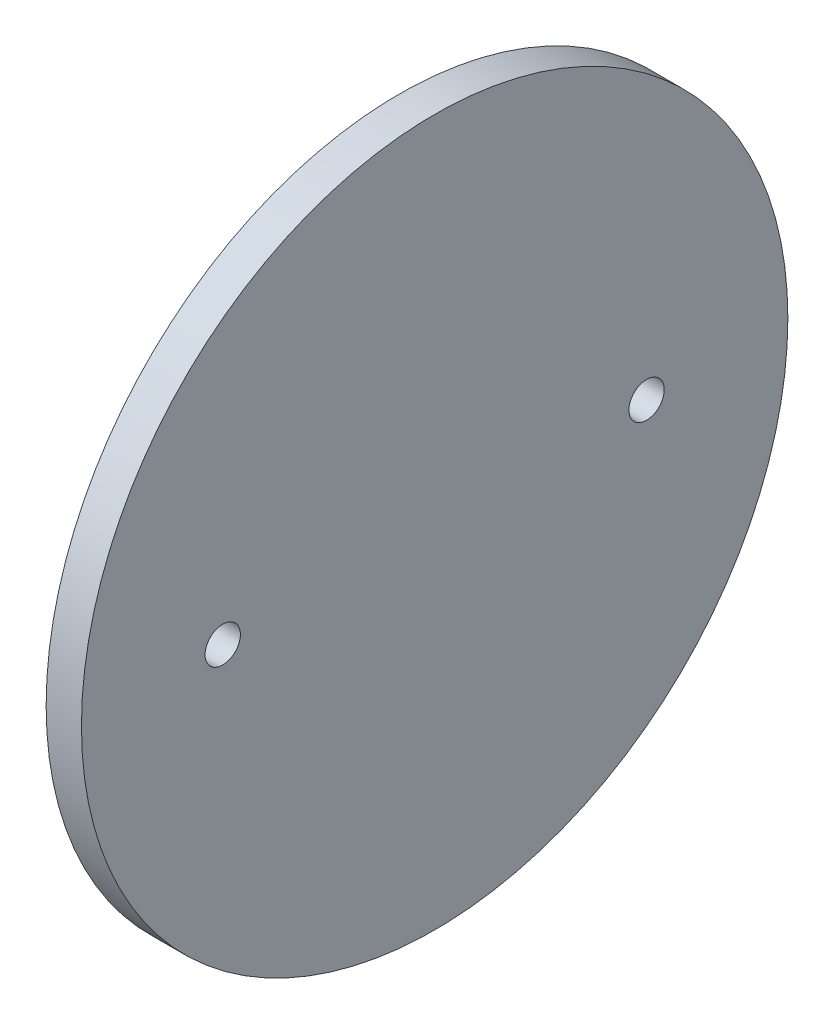
ISO-10303-21;
HEADER;
FILE_DESCRIPTION(('STEP AP214'),'2;1');
FILE_NAME('part.step','',(''),(''),'','','');
FILE_SCHEMA(('AUTOMOTIVE_DESIGN { 1 0 10303 214 1 1 1 1 }'));
ENDSEC;
DATA;
#1=APPLICATION_CONTEXT('core data for automotive mechanical design processes');
#2=APPLICATION_PROTOCOL_DEFINITION('international standard','automotive_design',2000,#1);
#3=PRODUCT_CONTEXT('',#1,'mechanical');
#4=PRODUCT('Part','Part','',(#3));
#5=PRODUCT_RELATED_PRODUCT_CATEGORY('part','',(#4));
#6=PRODUCT_DEFINITION_FORMATION('','',#4);
#7=PRODUCT_DEFINITION_CONTEXT('part definition',#1,'design');
#8=PRODUCT_DEFINITION('design','',#6,#7);
#9=PRODUCT_DEFINITION_SHAPE('','',#8);
#10=(LENGTH_UNIT() NAMED_UNIT(*) SI_UNIT(.MILLI.,.METRE.));
#11=(NAMED_UNIT(*) PLANE_ANGLE_UNIT() SI_UNIT($,.RADIAN.));
#12=(NAMED_UNIT(*) SI_UNIT($,.STERADIAN.) SOLID_ANGLE_UNIT());
#13=UNCERTAINTY_MEASURE_WITH_UNIT(LENGTH_MEASURE(1.E-05),#10,'distance_accuracy_value','');
#14=(GEOMETRIC_REPRESENTATION_CONTEXT(3) GLOBAL_UNCERTAINTY_ASSIGNED_CONTEXT((#13)) GLOBAL_UNIT_ASSIGNED_CONTEXT((#10,
#11,#12)) REPRESENTATION_CONTEXT('',''));
#15=CARTESIAN_POINT('',(0.,0.,0.));
#16=DIRECTION('',(0.,0.,1.));
#17=DIRECTION('',(1.,0.,0.));
#18=AXIS2_PLACEMENT_3D('',#15,#16,#17);
#19=CARTESIAN_POINT('',(6.35,0.,0.));
#20=DIRECTION('',(1.,0.,0.));
#21=DIRECTION('',(0.,0.,-1.));
#22=AXIS2_PLACEMENT_3D('',#19,#20,#21);
#23=PLANE('',#22);
#24=CARTESIAN_POINT('',(6.35,0.,-38.1));
#25=DIRECTION('',(1.,0.,0.));
#26=DIRECTION('',(0.,0.,-1.));
#27=AXIS2_PLACEMENT_3D('',#24,#25,#26);
#28=CIRCLE('',#27,3.175);
#29=CARTESIAN_POINT('',(6.35,0.,-41.275));
#30=VERTEX_POINT('',#29);
#31=EDGE_CURVE('E57',#30,#30,#28,.T.);
#32=ORIENTED_EDGE('',*,*,#31,.F.);
#33=EDGE_LOOP('',(#32));
#34=FACE_BOUND('',#33,.T.);
#35=CARTESIAN_POINT('',(6.35,0.,0.));
#36=DIRECTION('',(1.,0.,0.));
#37=DIRECTION('',(0.,0.,-1.));
#38=AXIS2_PLACEMENT_3D('',#35,#36,#37);
#39=CIRCLE('',#38,63.5);
#40=CARTESIAN_POINT('',(6.35,0.,-63.5));
#41=VERTEX_POINT('',#40);
#42=EDGE_CURVE('E10',#41,#41,#39,.T.);
#43=ORIENTED_EDGE('',*,*,#42,.T.);
#44=EDGE_LOOP('',(#43));
#45=FACE_BOUND('',#44,.T.);
#46=CARTESIAN_POINT('',(6.35,0.,38.1));
#47=DIRECTION('',(1.,0.,0.));
#48=DIRECTION('',(0.,0.,-1.));
#49=AXIS2_PLACEMENT_3D('',#46,#47,#48);
#50=CIRCLE('',#49,3.175);
#51=CARTESIAN_POINT('',(6.35,0.,34.925));
#52=VERTEX_POINT('',#51);
#53=EDGE_CURVE('E65',#52,#52,#50,.T.);
#54=ORIENTED_EDGE('',*,*,#53,.F.);
#55=EDGE_LOOP('',(#54));
#56=FACE_BOUND('',#55,.T.);
#57=ADVANCED_FACE('F43',(#34,#45,#56),#23,.T.);
#58=CARTESIAN_POINT('',(0.,0.,0.));
#59=DIRECTION('',(1.,0.,0.));
#60=DIRECTION('',(0.,0.,-1.));
#61=AXIS2_PLACEMENT_3D('',#58,#59,#60);
#62=PLANE('',#61);
#63=CARTESIAN_POINT('',(0.,0.,0.));
#64=DIRECTION('',(1.,0.,0.));
#65=DIRECTION('',(0.,0.,-1.));
#66=AXIS2_PLACEMENT_3D('',#63,#64,#65);
#67=CIRCLE('',#66,63.5);
#68=CARTESIAN_POINT('',(0.,0.,-63.5));
#69=VERTEX_POINT('',#68);
#70=EDGE_CURVE('E50',#69,#69,#67,.T.);
#71=ORIENTED_EDGE('',*,*,#70,.F.);
#72=EDGE_LOOP('',(#71));
#73=FACE_BOUND('',#72,.T.);
#74=CARTESIAN_POINT('',(0.,0.,-38.1));
#75=DIRECTION('',(1.,0.,0.));
#76=DIRECTION('',(0.,0.,-1.));
#77=AXIS2_PLACEMENT_3D('',#74,#75,#76);
#78=CIRCLE('',#77,3.175);
#79=CARTESIAN_POINT('',(0.,0.,-41.275));
#80=VERTEX_POINT('',#79);
#81=EDGE_CURVE('E59',#80,#80,#78,.T.);
#82=ORIENTED_EDGE('',*,*,#81,.T.);
#83=EDGE_LOOP('',(#82));
#84=FACE_BOUND('',#83,.T.);
#85=CARTESIAN_POINT('',(0.,0.,38.1));
#86=DIRECTION('',(1.,0.,0.));
#87=DIRECTION('',(0.,0.,-1.));
#88=AXIS2_PLACEMENT_3D('',#85,#86,#87);
#89=CIRCLE('',#88,3.175);
#90=CARTESIAN_POINT('',(0.,0.,34.925));
#91=VERTEX_POINT('',#90);
#92=EDGE_CURVE('E69',#91,#91,#89,.T.);
#93=ORIENTED_EDGE('',*,*,#92,.T.);
#94=EDGE_LOOP('',(#93));
#95=FACE_BOUND('',#94,.T.);
#96=ADVANCED_FACE('F76',(#73,#84,#95),#62,.F.);
#97=CARTESIAN_POINT('',(6.35,0.,0.));
#98=DIRECTION('',(-1.,0.,0.));
#99=DIRECTION('',(0.,0.,1.));
#100=AXIS2_PLACEMENT_3D('',#97,#98,#99);
#101=CYLINDRICAL_SURFACE('',#100,63.5);
#102=ORIENTED_EDGE('',*,*,#42,.F.);
#103=EDGE_LOOP('',(#102));
#104=FACE_BOUND('',#103,.T.);
#105=ORIENTED_EDGE('',*,*,#70,.T.);
#106=EDGE_LOOP('',(#105));
#107=FACE_BOUND('',#106,.T.);
#108=ADVANCED_FACE('F44',(#104,#107),#101,.T.);
#109=CARTESIAN_POINT('',(6.35,0.,-38.1));
#110=DIRECTION('',(-1.,0.,0.));
#111=DIRECTION('',(0.,0.,1.));
#112=AXIS2_PLACEMENT_3D('',#109,#110,#111);
#113=CYLINDRICAL_SURFACE('',#112,3.175);
#114=ORIENTED_EDGE('',*,*,#31,.T.);
#115=EDGE_LOOP('',(#114));
#116=FACE_BOUND('',#115,.T.);
#117=ORIENTED_EDGE('',*,*,#81,.F.);
#118=EDGE_LOOP('',(#117));
#119=FACE_BOUND('',#118,.T.);
#120=ADVANCED_FACE('F87',(#116,#119),#113,.F.);
#121=CARTESIAN_POINT('',(6.35,0.,38.1));
#122=DIRECTION('',(-1.,0.,0.));
#123=DIRECTION('',(0.,0.,1.));
#124=AXIS2_PLACEMENT_3D('',#121,#122,#123);
#125=CYLINDRICAL_SURFACE('',#124,3.175);
#126=ORIENTED_EDGE('',*,*,#53,.T.);
#127=EDGE_LOOP('',(#126));
#128=FACE_BOUND('',#127,.T.);
#129=ORIENTED_EDGE('',*,*,#92,.F.);
#130=EDGE_LOOP('',(#129));
#131=FACE_BOUND('',#130,.T.);
#132=ADVANCED_FACE('F74',(#128,#131),#125,.F.);
#133=CLOSED_SHELL('',(#57,#96,#108,#120,#132));
#134=MANIFOLD_SOLID_BREP('B2',#133);
#135=ADVANCED_BREP_SHAPE_REPRESENTATION('',(#18,#134),#14);
#136=SHAPE_DEFINITION_REPRESENTATION(#9,#135);
ENDSEC;
END-ISO-10303-21;
